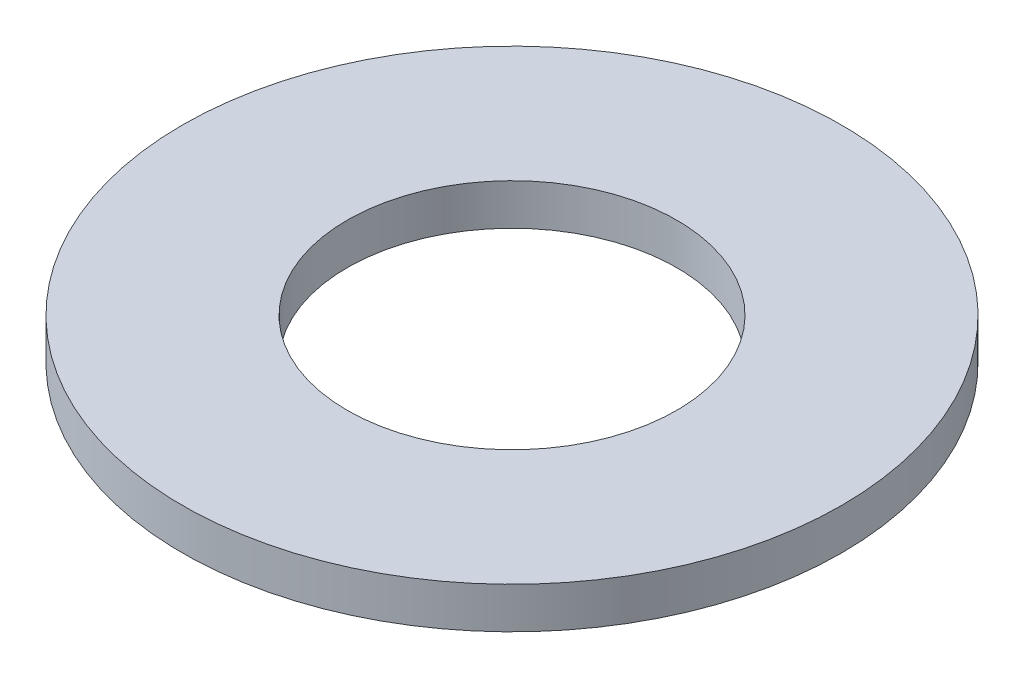
ISO-10303-21;
HEADER;
FILE_DESCRIPTION(('STEP AP214'),'2;1');
FILE_NAME('part.step','',(''),(''),'','','');
FILE_SCHEMA(('AUTOMOTIVE_DESIGN { 1 0 10303 214 1 1 1 1 }'));
ENDSEC;
DATA;
#1=APPLICATION_CONTEXT('core data for automotive mechanical design processes');
#2=APPLICATION_PROTOCOL_DEFINITION('international standard','automotive_design',2000,#1);
#3=PRODUCT_CONTEXT('',#1,'mechanical');
#4=PRODUCT('Part','Part','',(#3));
#5=PRODUCT_RELATED_PRODUCT_CATEGORY('part','',(#4));
#6=PRODUCT_DEFINITION_FORMATION('','',#4);
#7=PRODUCT_DEFINITION_CONTEXT('part definition',#1,'design');
#8=PRODUCT_DEFINITION('design','',#6,#7);
#9=PRODUCT_DEFINITION_SHAPE('','',#8);
#10=(LENGTH_UNIT() NAMED_UNIT(*) SI_UNIT(.MILLI.,.METRE.));
#11=(NAMED_UNIT(*) PLANE_ANGLE_UNIT() SI_UNIT($,.RADIAN.));
#12=(NAMED_UNIT(*) SI_UNIT($,.STERADIAN.) SOLID_ANGLE_UNIT());
#13=UNCERTAINTY_MEASURE_WITH_UNIT(LENGTH_MEASURE(1.E-05),#10,'distance_accuracy_value','');
#14=(GEOMETRIC_REPRESENTATION_CONTEXT(3) GLOBAL_UNCERTAINTY_ASSIGNED_CONTEXT((#13)) GLOBAL_UNIT_ASSIGNED_CONTEXT((#10,
#11,#12)) REPRESENTATION_CONTEXT('',''));
#15=CARTESIAN_POINT('',(0.,0.,0.));
#16=DIRECTION('',(0.,0.,1.));
#17=DIRECTION('',(1.,0.,0.));
#18=AXIS2_PLACEMENT_3D('',#15,#16,#17);
#19=CARTESIAN_POINT('',(0.,2.,0.));
#20=DIRECTION('',(0.,1.,0.));
#21=DIRECTION('',(0.,0.,1.));
#22=AXIS2_PLACEMENT_3D('',#19,#20,#21);
#23=PLANE('',#22);
#24=CARTESIAN_POINT('',(0.,2.,0.));
#25=DIRECTION('',(0.,1.,0.));
#26=DIRECTION('',(1.,0.,0.));
#27=AXIS2_PLACEMENT_3D('',#24,#25,#26);
#28=CIRCLE('',#27,16.);
#29=CARTESIAN_POINT('',(16.,2.,0.));
#30=VERTEX_POINT('',#29);
#31=EDGE_CURVE('E11',#30,#30,#28,.T.);
#32=ORIENTED_EDGE('',*,*,#31,.T.);
#33=EDGE_LOOP('',(#32));
#34=FACE_BOUND('',#33,.T.);
#35=CARTESIAN_POINT('',(0.,2.,0.));
#36=DIRECTION('',(0.,1.,0.));
#37=DIRECTION('',(0.,0.,1.));
#38=AXIS2_PLACEMENT_3D('',#35,#36,#37);
#39=CIRCLE('',#38,8.);
#40=CARTESIAN_POINT('',(0.,2.,8.));
#41=VERTEX_POINT('',#40);
#42=EDGE_CURVE('E62',#41,#41,#39,.T.);
#43=ORIENTED_EDGE('',*,*,#42,.F.);
#44=EDGE_LOOP('',(#43));
#45=FACE_BOUND('',#44,.T.);
#46=ADVANCED_FACE('F49',(#34,#45),#23,.T.);
#47=CARTESIAN_POINT('',(0.,0.,0.));
#48=DIRECTION('',(0.,1.,0.));
#49=DIRECTION('',(0.,0.,1.));
#50=AXIS2_PLACEMENT_3D('',#47,#48,#49);
#51=PLANE('',#50);
#52=CARTESIAN_POINT('',(0.,0.,0.));
#53=DIRECTION('',(0.,1.,0.));
#54=DIRECTION('',(1.,0.,0.));
#55=AXIS2_PLACEMENT_3D('',#52,#53,#54);
#56=CIRCLE('',#55,16.);
#57=CARTESIAN_POINT('',(16.,0.,0.));
#58=VERTEX_POINT('',#57);
#59=EDGE_CURVE('E53',#58,#58,#56,.T.);
#60=ORIENTED_EDGE('',*,*,#59,.F.);
#61=EDGE_LOOP('',(#60));
#62=FACE_BOUND('',#61,.T.);
#63=CARTESIAN_POINT('',(0.,0.,0.));
#64=DIRECTION('',(0.,1.,0.));
#65=DIRECTION('',(0.,0.,1.));
#66=AXIS2_PLACEMENT_3D('',#63,#64,#65);
#67=CIRCLE('',#66,8.);
#68=CARTESIAN_POINT('',(0.,0.,8.));
#69=VERTEX_POINT('',#68);
#70=EDGE_CURVE('E64',#69,#69,#67,.T.);
#71=ORIENTED_EDGE('',*,*,#70,.T.);
#72=EDGE_LOOP('',(#71));
#73=FACE_BOUND('',#72,.T.);
#74=ADVANCED_FACE('F76',(#62,#73),#51,.F.);
#75=CARTESIAN_POINT('',(0.,2.,0.));
#76=DIRECTION('',(0.,-1.,0.));
#77=DIRECTION('',(0.,0.,-1.));
#78=AXIS2_PLACEMENT_3D('',#75,#76,#77);
#79=CYLINDRICAL_SURFACE('',#78,16.);
#80=ORIENTED_EDGE('',*,*,#31,.F.);
#81=EDGE_LOOP('',(#80));
#82=FACE_BOUND('',#81,.T.);
#83=ORIENTED_EDGE('',*,*,#59,.T.);
#84=EDGE_LOOP('',(#83));
#85=FACE_BOUND('',#84,.T.);
#86=ADVANCED_FACE('F51',(#82,#85),#79,.T.);
#87=CARTESIAN_POINT('',(0.,2.,0.));
#88=DIRECTION('',(0.,-1.,0.));
#89=DIRECTION('',(0.,0.,-1.));
#90=AXIS2_PLACEMENT_3D('',#87,#88,#89);
#91=CYLINDRICAL_SURFACE('',#90,8.);
#92=ORIENTED_EDGE('',*,*,#42,.T.);
#93=EDGE_LOOP('',(#92));
#94=FACE_BOUND('',#93,.T.);
#95=ORIENTED_EDGE('',*,*,#70,.F.);
#96=EDGE_LOOP('',(#95));
#97=FACE_BOUND('',#96,.T.);
#98=ADVANCED_FACE('F72',(#94,#97),#91,.F.);
#99=CLOSED_SHELL('',(#46,#74,#86,#98));
#100=MANIFOLD_SOLID_BREP('B2',#99);
#101=ADVANCED_BREP_SHAPE_REPRESENTATION('',(#18,#100),#14);
#102=SHAPE_DEFINITION_REPRESENTATION(#9,#101);
ENDSEC;
END-ISO-10303-21;
